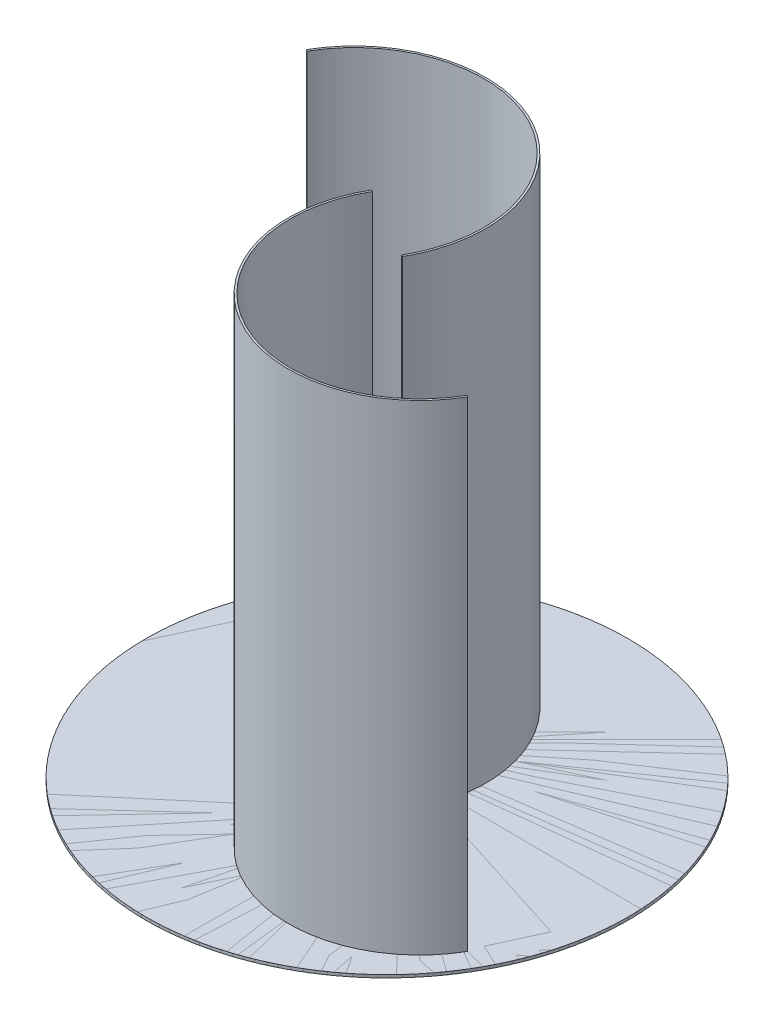
ISO-10303-21;
HEADER;
FILE_DESCRIPTION(('STEP AP214'),'2;1');
FILE_NAME('part.step','',(''),(''),'','','');
FILE_SCHEMA(('AUTOMOTIVE_DESIGN { 1 0 10303 214 1 1 1 1 }'));
ENDSEC;
DATA;
#1=APPLICATION_CONTEXT('core data for automotive mechanical design processes');
#2=APPLICATION_PROTOCOL_DEFINITION('international standard','automotive_design',2000,#1);
#3=PRODUCT_CONTEXT('',#1,'mechanical');
#4=PRODUCT('Part','Part','',(#3));
#5=PRODUCT_RELATED_PRODUCT_CATEGORY('part','',(#4));
#6=PRODUCT_DEFINITION_FORMATION('','',#4);
#7=PRODUCT_DEFINITION_CONTEXT('part definition',#1,'design');
#8=PRODUCT_DEFINITION('design','',#6,#7);
#9=PRODUCT_DEFINITION_SHAPE('','',#8);
#10=(LENGTH_UNIT() NAMED_UNIT(*) SI_UNIT(.MILLI.,.METRE.));
#11=(NAMED_UNIT(*) PLANE_ANGLE_UNIT() SI_UNIT($,.RADIAN.));
#12=(NAMED_UNIT(*) SI_UNIT($,.STERADIAN.) SOLID_ANGLE_UNIT());
#13=UNCERTAINTY_MEASURE_WITH_UNIT(LENGTH_MEASURE(1.E-05),#10,'distance_accuracy_value','');
#14=(GEOMETRIC_REPRESENTATION_CONTEXT(3) GLOBAL_UNCERTAINTY_ASSIGNED_CONTEXT((#13)) GLOBAL_UNIT_ASSIGNED_CONTEXT((#10,
#11,#12)) REPRESENTATION_CONTEXT('',''));
#15=CARTESIAN_POINT('',(0.,0.,0.));
#16=DIRECTION('',(0.,0.,1.));
#17=DIRECTION('',(1.,0.,0.));
#18=AXIS2_PLACEMENT_3D('',#15,#16,#17);
#19=CARTESIAN_POINT('',(0.,3.,0.));
#20=DIRECTION('',(0.,1.,0.));
#21=DIRECTION('',(0.,0.,-1.));
#22=AXIS2_PLACEMENT_3D('',#19,#20,#21);
#23=PLANE('',#22);
#24=CARTESIAN_POINT('',(0.,3.,0.));
#25=DIRECTION('',(0.,1.,0.));
#26=DIRECTION('',(0.,0.,-1.));
#27=AXIS2_PLACEMENT_3D('',#24,#25,#26);
#28=CIRCLE('',#27,250.);
#29=CARTESIAN_POINT('',(0.,3.,-250.));
#30=VERTEX_POINT('',#29);
#31=EDGE_CURVE('E12',#30,#30,#28,.T.);
#32=ORIENTED_EDGE('',*,*,#31,.T.);
#33=EDGE_LOOP('',(#32));
#34=FACE_BOUND('',#33,.T.);
#35=DIRECTION('',(-0.866025403784436,0.,-0.500000000000005));
#36=VECTOR('',#35,1.);
#37=CARTESIAN_POINT('',(197.689980809339,3.,114.136363636364));
#38=LINE('',#37,#36);
#39=CARTESIAN_POINT('',(197.689980809339,3.,114.136363636364));
#40=VERTEX_POINT('',#39);
#41=CARTESIAN_POINT('',(195.95793000177,3.,113.136363636364));
#42=VERTEX_POINT('',#41);
#43=EDGE_CURVE('E100',#40,#42,#38,.T.);
#44=ORIENTED_EDGE('',*,*,#43,.F.);
#45=CARTESIAN_POINT('',(79.910525894655,3.,46.1363636363638));
#46=DIRECTION('',(0.,1.,0.));
#47=DIRECTION('',(0.,0.,1.));
#48=AXIS2_PLACEMENT_3D('',#45,#46,#47);
#49=CIRCLE('',#48,136.);
#50=CARTESIAN_POINT('',(-37.8689290200286,3.,-21.8636363636364));
#51=VERTEX_POINT('',#50);
#52=EDGE_CURVE('E111',#51,#40,#49,.T.);
#53=ORIENTED_EDGE('',*,*,#52,.F.);
#54=DIRECTION('',(-0.866025403784438,0.,-0.500000000000001));
#55=VECTOR('',#54,1.);
#56=CARTESIAN_POINT('',(-36.1368782124597,3.,-20.8636363636364));
#57=LINE('',#56,#55);
#58=CARTESIAN_POINT('',(-36.1368782124597,3.,-20.8636363636363));
#59=VERTEX_POINT('',#58);
#60=EDGE_CURVE('E81',#59,#51,#57,.T.);
#61=ORIENTED_EDGE('',*,*,#60,.F.);
#62=CARTESIAN_POINT('',(79.910525894655,3.,46.1363636363638));
#63=DIRECTION('',(0.,-1.,0.));
#64=DIRECTION('',(0.,0.,1.));
#65=AXIS2_PLACEMENT_3D('',#62,#63,#64);
#66=CIRCLE('',#65,134.);
#67=EDGE_CURVE('E115',#42,#59,#66,.T.);
#68=ORIENTED_EDGE('',*,*,#67,.F.);
#69=EDGE_LOOP('',(#44,#53,#61,#68));
#70=FACE_BOUND('',#69,.T.);
#71=ADVANCED_FACE('F44',(#34,#70),#23,.T.);
#72=CARTESIAN_POINT('',(0.,3.,0.));
#73=DIRECTION('',(0.,-1.,0.));
#74=DIRECTION('',(0.,0.,1.));
#75=AXIS2_PLACEMENT_3D('',#72,#73,#74);
#76=CYLINDRICAL_SURFACE('',#75,250.);
#77=ORIENTED_EDGE('',*,*,#31,.F.);
#78=EDGE_LOOP('',(#77));
#79=FACE_BOUND('',#78,.T.);
#80=CARTESIAN_POINT('',(0.,0.,0.));
#81=DIRECTION('',(0.,1.,0.));
#82=DIRECTION('',(0.,0.,-1.));
#83=AXIS2_PLACEMENT_3D('',#80,#81,#82);
#84=CIRCLE('',#83,250.);
#85=CARTESIAN_POINT('',(0.,0.,-250.));
#86=VERTEX_POINT('',#85);
#87=EDGE_CURVE('E48',#86,#86,#84,.T.);
#88=ORIENTED_EDGE('',*,*,#87,.T.);
#89=EDGE_LOOP('',(#88));
#90=FACE_BOUND('',#89,.T.);
#91=ADVANCED_FACE('F46',(#79,#90),#76,.T.);
#92=CARTESIAN_POINT('',(0.,0.,0.));
#93=DIRECTION('',(0.,1.,0.));
#94=DIRECTION('',(0.,0.,-1.));
#95=AXIS2_PLACEMENT_3D('',#92,#93,#94);
#96=PLANE('',#95);
#97=ORIENTED_EDGE('',*,*,#87,.F.);
#98=EDGE_LOOP('',(#97));
#99=FACE_BOUND('',#98,.T.);
#100=ADVANCED_FACE('F124',(#99),#96,.F.);
#101=CARTESIAN_POINT('',(79.910525894655,501.,46.1363636363638));
#102=DIRECTION('',(0.,-1.,0.));
#103=DIRECTION('',(0.,0.,1.));
#104=AXIS2_PLACEMENT_3D('',#101,#102,#103);
#105=CYLINDRICAL_SURFACE('',#104,136.);
#106=ORIENTED_EDGE('',*,*,#52,.T.);
#107=DIRECTION('',(0.,-1.,0.));
#108=VECTOR('',#107,1.);
#109=CARTESIAN_POINT('',(197.689980809339,501.,114.136363636364));
#110=LINE('',#109,#108);
#111=CARTESIAN_POINT('',(197.689980809339,501.,114.136363636364));
#112=VERTEX_POINT('',#111);
#113=EDGE_CURVE('E103',#112,#40,#110,.T.);
#114=ORIENTED_EDGE('',*,*,#113,.F.);
#115=CARTESIAN_POINT('',(79.910525894655,501.,46.1363636363638));
#116=DIRECTION('',(0.,1.,0.));
#117=DIRECTION('',(0.,0.,1.));
#118=AXIS2_PLACEMENT_3D('',#115,#116,#117);
#119=CIRCLE('',#118,136.);
#120=CARTESIAN_POINT('',(-37.8689290200286,501.,-21.8636363636364));
#121=VERTEX_POINT('',#120);
#122=EDGE_CURVE('E93',#121,#112,#119,.T.);
#123=ORIENTED_EDGE('',*,*,#122,.F.);
#124=DIRECTION('',(0.,-1.,0.));
#125=VECTOR('',#124,1.);
#126=CARTESIAN_POINT('',(-37.8689290200286,501.,-21.8636363636364));
#127=LINE('',#126,#125);
#128=EDGE_CURVE('E107',#121,#51,#127,.T.);
#129=ORIENTED_EDGE('',*,*,#128,.T.);
#130=EDGE_LOOP('',(#106,#114,#123,#129));
#131=FACE_BOUND('',#130,.T.);
#132=ADVANCED_FACE('F126',(#131),#105,.T.);
#133=CARTESIAN_POINT('',(197.689980809339,501.,114.136363636364));
#134=DIRECTION('',(-0.500000000000005,0.,0.866025403784436));
#135=DIRECTION('',(0.866025403784436,0.,0.500000000000005));
#136=AXIS2_PLACEMENT_3D('',#133,#134,#135);
#137=PLANE('',#136);
#138=ORIENTED_EDGE('',*,*,#43,.T.);
#139=DIRECTION('',(0.,-1.,0.));
#140=VECTOR('',#139,1.);
#141=CARTESIAN_POINT('',(195.95793000177,501.,113.136363636364));
#142=LINE('',#141,#140);
#143=CARTESIAN_POINT('',(195.95793000177,501.,113.136363636364));
#144=VERTEX_POINT('',#143);
#145=EDGE_CURVE('E97',#144,#42,#142,.T.);
#146=ORIENTED_EDGE('',*,*,#145,.F.);
#147=DIRECTION('',(-0.866025403784436,0.,-0.500000000000005));
#148=VECTOR('',#147,1.);
#149=CARTESIAN_POINT('',(197.689980809339,501.,114.136363636364));
#150=LINE('',#149,#148);
#151=EDGE_CURVE('E88',#112,#144,#150,.T.);
#152=ORIENTED_EDGE('',*,*,#151,.F.);
#153=ORIENTED_EDGE('',*,*,#113,.T.);
#154=EDGE_LOOP('',(#138,#146,#152,#153));
#155=FACE_BOUND('',#154,.T.);
#156=ADVANCED_FACE('F98',(#155),#137,.F.);
#157=CARTESIAN_POINT('',(79.910525894655,501.,46.1363636363638));
#158=DIRECTION('',(0.,-1.,0.));
#159=DIRECTION('',(0.,0.,1.));
#160=AXIS2_PLACEMENT_3D('',#157,#158,#159);
#161=CYLINDRICAL_SURFACE('',#160,134.);
#162=ORIENTED_EDGE('',*,*,#67,.T.);
#163=DIRECTION('',(0.,-1.,0.));
#164=VECTOR('',#163,1.);
#165=CARTESIAN_POINT('',(-36.1368782124597,501.,-20.8636363636364));
#166=LINE('',#165,#164);
#167=CARTESIAN_POINT('',(-36.1368782124597,501.,-20.8636363636364));
#168=VERTEX_POINT('',#167);
#169=EDGE_CURVE('E59',#168,#59,#166,.T.);
#170=ORIENTED_EDGE('',*,*,#169,.F.);
#171=CARTESIAN_POINT('',(79.910525894655,501.,46.1363636363638));
#172=DIRECTION('',(0.,-1.,0.));
#173=DIRECTION('',(0.,0.,1.));
#174=AXIS2_PLACEMENT_3D('',#171,#172,#173);
#175=CIRCLE('',#174,134.);
#176=EDGE_CURVE('E91',#144,#168,#175,.T.);
#177=ORIENTED_EDGE('',*,*,#176,.F.);
#178=ORIENTED_EDGE('',*,*,#145,.T.);
#179=EDGE_LOOP('',(#162,#170,#177,#178));
#180=FACE_BOUND('',#179,.T.);
#181=ADVANCED_FACE('F105',(#180),#161,.F.);
#182=CARTESIAN_POINT('',(-36.1368782124597,501.,-20.8636363636364));
#183=DIRECTION('',(-0.500000000000001,0.,0.866025403784438));
#184=DIRECTION('',(0.866025403784438,0.,0.500000000000001));
#185=AXIS2_PLACEMENT_3D('',#182,#183,#184);
#186=PLANE('',#185);
#187=ORIENTED_EDGE('',*,*,#60,.T.);
#188=ORIENTED_EDGE('',*,*,#128,.F.);
#189=DIRECTION('',(-0.866025403784438,0.,-0.500000000000001));
#190=VECTOR('',#189,1.);
#191=CARTESIAN_POINT('',(-36.1368782124597,501.,-20.8636363636364));
#192=LINE('',#191,#190);
#193=EDGE_CURVE('E67',#168,#121,#192,.T.);
#194=ORIENTED_EDGE('',*,*,#193,.F.);
#195=ORIENTED_EDGE('',*,*,#169,.T.);
#196=EDGE_LOOP('',(#187,#188,#194,#195));
#197=FACE_BOUND('',#196,.T.);
#198=ADVANCED_FACE('F145',(#197),#186,.F.);
#199=CARTESIAN_POINT('',(79.910525894655,501.,46.1363636363638));
#200=DIRECTION('',(0.,-1.,0.));
#201=DIRECTION('',(0.,0.,1.));
#202=AXIS2_PLACEMENT_3D('',#199,#200,#201);
#203=PLANE('',#202);
#204=ORIENTED_EDGE('',*,*,#122,.T.);
#205=ORIENTED_EDGE('',*,*,#151,.T.);
#206=ORIENTED_EDGE('',*,*,#176,.T.);
#207=ORIENTED_EDGE('',*,*,#193,.T.);
#208=EDGE_LOOP('',(#204,#205,#206,#207));
#209=FACE_BOUND('',#208,.T.);
#210=ADVANCED_FACE('F89',(#209),#203,.F.);
#211=CLOSED_SHELL('',(#71,#91,#100,#132,#156,#181,#198,#210));
#212=MANIFOLD_SOLID_BREP('B2',#211);
#213=CARTESIAN_POINT('',(0.,3.,0.));
#214=DIRECTION('',(0.,1.,0.));
#215=DIRECTION('',(0.,0.,1.));
#216=AXIS2_PLACEMENT_3D('',#213,#214,#215);
#217=PLANE('',#216);
#218=CARTESIAN_POINT('',(0.,3.,0.));
#219=DIRECTION('',(0.,1.,0.));
#220=DIRECTION('',(0.,0.,1.));
#221=AXIS2_PLACEMENT_3D('',#218,#219,#220);
#222=CIRCLE('',#221,250.);
#223=CARTESIAN_POINT('',(0.,3.,250.));
#224=VERTEX_POINT('',#223);
#225=EDGE_CURVE('E42',#224,#224,#222,.T.);
#226=ORIENTED_EDGE('',*,*,#225,.T.);
#227=EDGE_LOOP('',(#226));
#228=FACE_BOUND('',#227,.T.);
#229=DIRECTION('',(0.866025403784436,0.,0.500000000000005));
#230=VECTOR('',#229,1.);
#231=CARTESIAN_POINT('',(-197.689980809339,3.,-114.136363636364));
#232=LINE('',#231,#230);
#233=CARTESIAN_POINT('',(-197.689980809339,3.,-114.136363636364));
#234=VERTEX_POINT('',#233);
#235=CARTESIAN_POINT('',(-195.95793000177,3.,-113.136363636364));
#236=VERTEX_POINT('',#235);
#237=EDGE_CURVE('E253',#234,#236,#232,.T.);
#238=ORIENTED_EDGE('',*,*,#237,.F.);
#239=CARTESIAN_POINT('',(-79.910525894655,3.,-46.1363636363638));
#240=DIRECTION('',(0.,1.,0.));
#241=DIRECTION('',(0.,0.,-1.));
#242=AXIS2_PLACEMENT_3D('',#239,#240,#241);
#243=CIRCLE('',#242,136.);
#244=CARTESIAN_POINT('',(37.8689290200286,3.,21.8636363636364));
#245=VERTEX_POINT('',#244);
#246=EDGE_CURVE('E264',#245,#234,#243,.T.);
#247=ORIENTED_EDGE('',*,*,#246,.F.);
#248=DIRECTION('',(0.866025403784438,0.,0.500000000000001));
#249=VECTOR('',#248,1.);
#250=CARTESIAN_POINT('',(36.1368782124597,3.,20.8636363636364));
#251=LINE('',#250,#249);
#252=CARTESIAN_POINT('',(36.1368782124597,3.,20.8636363636363));
#253=VERTEX_POINT('',#252);
#254=EDGE_CURVE('E234',#253,#245,#251,.T.);
#255=ORIENTED_EDGE('',*,*,#254,.F.);
#256=CARTESIAN_POINT('',(-79.910525894655,3.,-46.1363636363638));
#257=DIRECTION('',(0.,-1.,0.));
#258=DIRECTION('',(0.,0.,-1.));
#259=AXIS2_PLACEMENT_3D('',#256,#257,#258);
#260=CIRCLE('',#259,134.);
#261=EDGE_CURVE('E268',#236,#253,#260,.T.);
#262=ORIENTED_EDGE('',*,*,#261,.F.);
#263=EDGE_LOOP('',(#238,#247,#255,#262));
#264=FACE_BOUND('',#263,.T.);
#265=ADVANCED_FACE('F197',(#228,#264),#217,.T.);
#266=CARTESIAN_POINT('',(0.,3.,0.));
#267=DIRECTION('',(0.,-1.,0.));
#268=DIRECTION('',(0.,0.,-1.));
#269=AXIS2_PLACEMENT_3D('',#266,#267,#268);
#270=CYLINDRICAL_SURFACE('',#269,250.);
#271=ORIENTED_EDGE('',*,*,#225,.F.);
#272=EDGE_LOOP('',(#271));
#273=FACE_BOUND('',#272,.T.);
#274=CARTESIAN_POINT('',(0.,0.,0.));
#275=DIRECTION('',(0.,1.,0.));
#276=DIRECTION('',(0.,0.,1.));
#277=AXIS2_PLACEMENT_3D('',#274,#275,#276);
#278=CIRCLE('',#277,250.);
#279=CARTESIAN_POINT('',(0.,0.,250.));
#280=VERTEX_POINT('',#279);
#281=EDGE_CURVE('E201',#280,#280,#278,.T.);
#282=ORIENTED_EDGE('',*,*,#281,.T.);
#283=EDGE_LOOP('',(#282));
#284=FACE_BOUND('',#283,.T.);
#285=ADVANCED_FACE('F199',(#273,#284),#270,.T.);
#286=CARTESIAN_POINT('',(0.,0.,0.));
#287=DIRECTION('',(0.,1.,0.));
#288=DIRECTION('',(0.,0.,1.));
#289=AXIS2_PLACEMENT_3D('',#286,#287,#288);
#290=PLANE('',#289);
#291=ORIENTED_EDGE('',*,*,#281,.F.);
#292=EDGE_LOOP('',(#291));
#293=FACE_BOUND('',#292,.T.);
#294=ADVANCED_FACE('F277',(#293),#290,.F.);
#295=CARTESIAN_POINT('',(-79.910525894655,501.,-46.1363636363638));
#296=DIRECTION('',(0.,-1.,0.));
#297=DIRECTION('',(0.,0.,-1.));
#298=AXIS2_PLACEMENT_3D('',#295,#296,#297);
#299=CYLINDRICAL_SURFACE('',#298,136.);
#300=ORIENTED_EDGE('',*,*,#246,.T.);
#301=DIRECTION('',(0.,-1.,0.));
#302=VECTOR('',#301,1.);
#303=CARTESIAN_POINT('',(-197.689980809339,501.,-114.136363636364));
#304=LINE('',#303,#302);
#305=CARTESIAN_POINT('',(-197.689980809339,501.,-114.136363636364));
#306=VERTEX_POINT('',#305);
#307=EDGE_CURVE('E256',#306,#234,#304,.T.);
#308=ORIENTED_EDGE('',*,*,#307,.F.);
#309=CARTESIAN_POINT('',(-79.910525894655,501.,-46.1363636363638));
#310=DIRECTION('',(0.,1.,0.));
#311=DIRECTION('',(0.,0.,-1.));
#312=AXIS2_PLACEMENT_3D('',#309,#310,#311);
#313=CIRCLE('',#312,136.);
#314=CARTESIAN_POINT('',(37.8689290200286,501.,21.8636363636364));
#315=VERTEX_POINT('',#314);
#316=EDGE_CURVE('E246',#315,#306,#313,.T.);
#317=ORIENTED_EDGE('',*,*,#316,.F.);
#318=DIRECTION('',(0.,-1.,0.));
#319=VECTOR('',#318,1.);
#320=CARTESIAN_POINT('',(37.8689290200286,501.,21.8636363636364));
#321=LINE('',#320,#319);
#322=EDGE_CURVE('E260',#315,#245,#321,.T.);
#323=ORIENTED_EDGE('',*,*,#322,.T.);
#324=EDGE_LOOP('',(#300,#308,#317,#323));
#325=FACE_BOUND('',#324,.T.);
#326=ADVANCED_FACE('F279',(#325),#299,.T.);
#327=CARTESIAN_POINT('',(-197.689980809339,501.,-114.136363636364));
#328=DIRECTION('',(0.500000000000005,0.,-0.866025403784436));
#329=DIRECTION('',(-0.866025403784436,0.,-0.500000000000005));
#330=AXIS2_PLACEMENT_3D('',#327,#328,#329);
#331=PLANE('',#330);
#332=ORIENTED_EDGE('',*,*,#237,.T.);
#333=DIRECTION('',(0.,-1.,0.));
#334=VECTOR('',#333,1.);
#335=CARTESIAN_POINT('',(-195.95793000177,501.,-113.136363636364));
#336=LINE('',#335,#334);
#337=CARTESIAN_POINT('',(-195.95793000177,501.,-113.136363636364));
#338=VERTEX_POINT('',#337);
#339=EDGE_CURVE('E250',#338,#236,#336,.T.);
#340=ORIENTED_EDGE('',*,*,#339,.F.);
#341=DIRECTION('',(0.866025403784436,0.,0.500000000000005));
#342=VECTOR('',#341,1.);
#343=CARTESIAN_POINT('',(-197.689980809339,501.,-114.136363636364));
#344=LINE('',#343,#342);
#345=EDGE_CURVE('E241',#306,#338,#344,.T.);
#346=ORIENTED_EDGE('',*,*,#345,.F.);
#347=ORIENTED_EDGE('',*,*,#307,.T.);
#348=EDGE_LOOP('',(#332,#340,#346,#347));
#349=FACE_BOUND('',#348,.T.);
#350=ADVANCED_FACE('F251',(#349),#331,.F.);
#351=CARTESIAN_POINT('',(-79.910525894655,501.,-46.1363636363638));
#352=DIRECTION('',(0.,-1.,0.));
#353=DIRECTION('',(0.,0.,-1.));
#354=AXIS2_PLACEMENT_3D('',#351,#352,#353);
#355=CYLINDRICAL_SURFACE('',#354,134.);
#356=ORIENTED_EDGE('',*,*,#261,.T.);
#357=DIRECTION('',(0.,-1.,0.));
#358=VECTOR('',#357,1.);
#359=CARTESIAN_POINT('',(36.1368782124597,501.,20.8636363636364));
#360=LINE('',#359,#358);
#361=CARTESIAN_POINT('',(36.1368782124597,501.,20.8636363636364));
#362=VERTEX_POINT('',#361);
#363=EDGE_CURVE('E212',#362,#253,#360,.T.);
#364=ORIENTED_EDGE('',*,*,#363,.F.);
#365=CARTESIAN_POINT('',(-79.910525894655,501.,-46.1363636363638));
#366=DIRECTION('',(0.,-1.,0.));
#367=DIRECTION('',(0.,0.,-1.));
#368=AXIS2_PLACEMENT_3D('',#365,#366,#367);
#369=CIRCLE('',#368,134.);
#370=EDGE_CURVE('E244',#338,#362,#369,.T.);
#371=ORIENTED_EDGE('',*,*,#370,.F.);
#372=ORIENTED_EDGE('',*,*,#339,.T.);
#373=EDGE_LOOP('',(#356,#364,#371,#372));
#374=FACE_BOUND('',#373,.T.);
#375=ADVANCED_FACE('F258',(#374),#355,.F.);
#376=CARTESIAN_POINT('',(36.1368782124597,501.,20.8636363636364));
#377=DIRECTION('',(0.500000000000001,0.,-0.866025403784438));
#378=DIRECTION('',(-0.866025403784438,0.,-0.500000000000001));
#379=AXIS2_PLACEMENT_3D('',#376,#377,#378);
#380=PLANE('',#379);
#381=ORIENTED_EDGE('',*,*,#254,.T.);
#382=ORIENTED_EDGE('',*,*,#322,.F.);
#383=DIRECTION('',(0.866025403784438,0.,0.500000000000001));
#384=VECTOR('',#383,1.);
#385=CARTESIAN_POINT('',(36.1368782124597,501.,20.8636363636364));
#386=LINE('',#385,#384);
#387=EDGE_CURVE('E220',#362,#315,#386,.T.);
#388=ORIENTED_EDGE('',*,*,#387,.F.);
#389=ORIENTED_EDGE('',*,*,#363,.T.);
#390=EDGE_LOOP('',(#381,#382,#388,#389));
#391=FACE_BOUND('',#390,.T.);
#392=ADVANCED_FACE('F298',(#391),#380,.F.);
#393=CARTESIAN_POINT('',(-79.910525894655,501.,-46.1363636363638));
#394=DIRECTION('',(0.,-1.,0.));
#395=DIRECTION('',(0.,0.,-1.));
#396=AXIS2_PLACEMENT_3D('',#393,#394,#395);
#397=PLANE('',#396);
#398=ORIENTED_EDGE('',*,*,#316,.T.);
#399=ORIENTED_EDGE('',*,*,#345,.T.);
#400=ORIENTED_EDGE('',*,*,#370,.T.);
#401=ORIENTED_EDGE('',*,*,#387,.T.);
#402=EDGE_LOOP('',(#398,#399,#400,#401));
#403=FACE_BOUND('',#402,.T.);
#404=ADVANCED_FACE('F242',(#403),#397,.F.);
#405=CLOSED_SHELL('',(#265,#285,#294,#326,#350,#375,#392,#404));
#406=MANIFOLD_SOLID_BREP('B6',#405);
#407=ADVANCED_BREP_SHAPE_REPRESENTATION('',(#18,#212,#406),#14);
#408=SHAPE_DEFINITION_REPRESENTATION(#9,#407);
ENDSEC;
END-ISO-10303-21;
